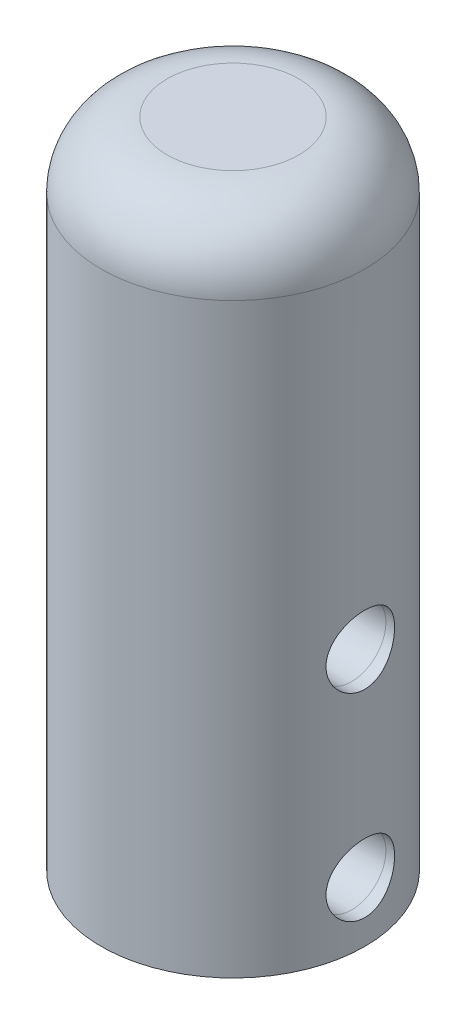
ISO-10303-21;
HEADER;
FILE_DESCRIPTION(('STEP AP214'),'2;1');
FILE_NAME('part.step','',(''),(''),'','','');
FILE_SCHEMA(('AUTOMOTIVE_DESIGN { 1 0 10303 214 1 1 1 1 }'));
ENDSEC;
DATA;
#1=APPLICATION_CONTEXT('core data for automotive mechanical design processes');
#2=APPLICATION_PROTOCOL_DEFINITION('international standard','automotive_design',2000,#1);
#3=PRODUCT_CONTEXT('',#1,'mechanical');
#4=PRODUCT('Part','Part','',(#3));
#5=PRODUCT_RELATED_PRODUCT_CATEGORY('part','',(#4));
#6=PRODUCT_DEFINITION_FORMATION('','',#4);
#7=PRODUCT_DEFINITION_CONTEXT('part definition',#1,'design');
#8=PRODUCT_DEFINITION('design','',#6,#7);
#9=PRODUCT_DEFINITION_SHAPE('','',#8);
#10=(LENGTH_UNIT() NAMED_UNIT(*) SI_UNIT(.MILLI.,.METRE.));
#11=(NAMED_UNIT(*) PLANE_ANGLE_UNIT() SI_UNIT($,.RADIAN.));
#12=(NAMED_UNIT(*) SI_UNIT($,.STERADIAN.) SOLID_ANGLE_UNIT());
#13=UNCERTAINTY_MEASURE_WITH_UNIT(LENGTH_MEASURE(1.E-05),#10,'distance_accuracy_value','');
#14=(GEOMETRIC_REPRESENTATION_CONTEXT(3) GLOBAL_UNCERTAINTY_ASSIGNED_CONTEXT((#13)) GLOBAL_UNIT_ASSIGNED_CONTEXT((#10,
#11,#12)) REPRESENTATION_CONTEXT('',''));
#15=CARTESIAN_POINT('',(0.,0.,0.));
#16=DIRECTION('',(0.,0.,1.));
#17=DIRECTION('',(1.,0.,0.));
#18=AXIS2_PLACEMENT_3D('',#15,#16,#17);
#19=CARTESIAN_POINT('',(-33.645,95.,0.));
#20=DIRECTION('',(1.,0.,0.));
#21=DIRECTION('',(0.,0.,-1.));
#22=AXIS2_PLACEMENT_3D('',#19,#20,#21);
#23=CYLINDRICAL_SURFACE('',#22,1.70000000000001);
#24=CARTESIAN_POINT('',(-27.545,95.,0.));
#25=DIRECTION('',(-1.,0.,0.));
#26=DIRECTION('',(0.,-1.,0.));
#27=AXIS2_PLACEMENT_3D('',#24,#25,#26);
#28=CIRCLE('',#27,1.70000000000001);
#29=CARTESIAN_POINT('',(-27.545,93.3,0.));
#30=VERTEX_POINT('',#29);
#31=EDGE_CURVE('E121',#30,#30,#28,.T.);
#32=ORIENTED_EDGE('',*,*,#31,.F.);
#33=EDGE_LOOP('',(#32));
#34=FACE_BOUND('',#33,.T.);
#35=CARTESIAN_POINT('',(-30.145,95.,0.));
#36=DIRECTION('',(-1.,0.,0.));
#37=DIRECTION('',(0.,-1.,0.));
#38=AXIS2_PLACEMENT_3D('',#35,#36,#37);
#39=CIRCLE('',#38,1.70000000000001);
#40=CARTESIAN_POINT('',(-30.145,93.3,0.));
#41=VERTEX_POINT('',#40);
#42=EDGE_CURVE('E210',#41,#41,#39,.F.);
#43=ORIENTED_EDGE('',*,*,#42,.F.);
#44=EDGE_LOOP('',(#43));
#45=FACE_BOUND('',#44,.T.);
#46=ADVANCED_FACE('F35',(#34,#45),#23,.F.);
#47=CARTESIAN_POINT('',(-33.645,80.,0.));
#48=DIRECTION('',(1.,0.,0.));
#49=DIRECTION('',(0.,0.,-1.));
#50=AXIS2_PLACEMENT_3D('',#47,#48,#49);
#51=CYLINDRICAL_SURFACE('',#50,1.70000000000001);
#52=CARTESIAN_POINT('',(-27.545,80.,0.));
#53=DIRECTION('',(-1.,0.,0.));
#54=DIRECTION('',(0.,-1.,0.));
#55=AXIS2_PLACEMENT_3D('',#52,#53,#54);
#56=CIRCLE('',#55,1.70000000000001);
#57=CARTESIAN_POINT('',(-27.545,78.3,0.));
#58=VERTEX_POINT('',#57);
#59=EDGE_CURVE('E126',#58,#58,#56,.T.);
#60=ORIENTED_EDGE('',*,*,#59,.F.);
#61=EDGE_LOOP('',(#60));
#62=FACE_BOUND('',#61,.T.);
#63=CARTESIAN_POINT('',(-30.145,80.,0.));
#64=DIRECTION('',(-1.,0.,0.));
#65=DIRECTION('',(0.,-1.,0.));
#66=AXIS2_PLACEMENT_3D('',#63,#64,#65);
#67=CIRCLE('',#66,1.70000000000001);
#68=CARTESIAN_POINT('',(-30.145,78.3,0.));
#69=VERTEX_POINT('',#68);
#70=EDGE_CURVE('E213',#69,#69,#67,.F.);
#71=ORIENTED_EDGE('',*,*,#70,.F.);
#72=EDGE_LOOP('',(#71));
#73=FACE_BOUND('',#72,.T.);
#74=ADVANCED_FACE('F173',(#62,#73),#51,.F.);
#75=CARTESIAN_POINT('',(-23.645,46.7157287525381,0.));
#76=DIRECTION('',(0.,1.,0.));
#77=DIRECTION('',(-1.,0.,0.));
#78=AXIS2_PLACEMENT_3D('',#75,#76,#77);
#79=CYLINDRICAL_SURFACE('',#78,10.);
#80=CARTESIAN_POINT('',(-33.645,77.15,0.));
#81=CARTESIAN_POINT('',(-33.6449981148392,77.1500028038685,0.156702222055426));
#82=CARTESIAN_POINT('',(-33.6412809618987,77.1629670882105,0.313433312054446));
#83=CARTESIAN_POINT('',(-33.6268145988117,77.2143732014747,0.622353947826402));
#84=CARTESIAN_POINT('',(-33.6160626998475,77.2528247722106,0.774541733793407));
#85=CARTESIAN_POINT('',(-33.5887089739797,77.3538338829002,1.06987393942644));
#86=CARTESIAN_POINT('',(-33.5721152825365,77.4163579100891,1.21303061082524));
#87=CARTESIAN_POINT('',(-33.5348159939189,77.5636057144373,1.48682768012773));
#88=CARTESIAN_POINT('',(-33.5141099724456,77.6483317826304,1.6174667844396));
#89=CARTESIAN_POINT('',(-33.4702011748781,77.8399174044409,1.86593929261577));
#90=CARTESIAN_POINT('',(-33.4469510780771,77.9472512808776,1.98339859784889));
#91=CARTESIAN_POINT('',(-33.400866628841,78.1799934404885,2.1989173339478));
#92=CARTESIAN_POINT('',(-33.3780323388465,78.3054044134504,2.29697387261132));
#93=CARTESIAN_POINT('',(-33.334872119392,78.5738227536689,2.47280459739312));
#94=CARTESIAN_POINT('',(-33.3146054240114,78.7171316385792,2.55013438673269));
#95=CARTESIAN_POINT('',(-33.2795770599847,79.0153892871087,2.67944864193718));
#96=CARTESIAN_POINT('',(-33.2648142138603,79.170335552527,2.73143852968244));
#97=CARTESIAN_POINT('',(-33.2429560752628,79.4832944949959,2.80727118973494));
#98=CARTESIAN_POINT('',(-33.2356747031502,79.6411279762955,2.83179848433712));
#99=CARTESIAN_POINT('',(-33.2290492312009,79.9588245656897,2.85414576761167));
#100=CARTESIAN_POINT('',(-33.2297034162181,80.1186872277472,2.85197152740062));
#101=CARTESIAN_POINT('',(-33.2387094658298,80.4304435713915,2.82151778088379));
#102=CARTESIAN_POINT('',(-33.2468125321654,80.5824280254272,2.79408198213026));
#103=CARTESIAN_POINT('',(-33.2694027480574,80.879541178131,2.71524157426037));
#104=CARTESIAN_POINT('',(-33.2838904721658,81.0246692584959,2.66383480798507));
#105=CARTESIAN_POINT('',(-33.317825415122,81.3060761777278,2.53786006677916));
#106=CARTESIAN_POINT('',(-33.3373328525366,81.4422203966578,2.46300828391955));
#107=CARTESIAN_POINT('',(-33.3790787056095,81.7003050264222,2.29246582180281));
#108=CARTESIAN_POINT('',(-33.4013177260943,81.822242279864,2.19677052373737));
#109=CARTESIAN_POINT('',(-33.4470424004349,82.053253779884,1.98300978221846));
#110=CARTESIAN_POINT('',(-33.4705435339757,82.1616744275809,1.86424019424136));
#111=CARTESIAN_POINT('',(-33.5154015954441,82.3572031477741,1.60991372563512));
#112=CARTESIAN_POINT('',(-33.5367584133177,82.4443101267055,1.47435598417412));
#113=CARTESIAN_POINT('',(-33.5750854943689,82.5950843086651,1.18919510835358));
#114=CARTESIAN_POINT('',(-33.5920307943484,82.6586189490998,1.0395183061524));
#115=CARTESIAN_POINT('',(-33.6194456606564,82.759427205276,0.731011523282429));
#116=CARTESIAN_POINT('',(-33.6299168506962,82.7967074059756,0.572183848591747));
#117=CARTESIAN_POINT('',(-33.64295204675,82.8428892069603,0.255450137061612));
#118=CARTESIAN_POINT('',(-33.645763127856,82.8526778714578,0.0976834116708369));
#119=CARTESIAN_POINT('',(-33.643879508611,82.8460680946158,-0.217242667325456));
#120=CARTESIAN_POINT('',(-33.6391857039904,82.8296727784125,-0.374402091170115));
#121=CARTESIAN_POINT('',(-33.6229805542209,82.7718828957831,-0.680388673532275));
#122=CARTESIAN_POINT('',(-33.6116076772171,82.7309957507387,-0.829319683438056));
#123=CARTESIAN_POINT('',(-33.5833471400501,82.6259834606804,-1.11818480443486));
#124=CARTESIAN_POINT('',(-33.5664588435169,82.5618556340586,-1.25811787511105));
#125=CARTESIAN_POINT('',(-33.5284781124918,82.4106215774358,-1.52836402911181));
#126=CARTESIAN_POINT('',(-33.5073028451789,82.3230494984291,-1.65840447139229));
#127=CARTESIAN_POINT('',(-33.4631882997216,82.1279876497973,-1.90225112974461));
#128=CARTESIAN_POINT('',(-33.4402486230098,82.0204933721145,-2.01605366111468));
#129=CARTESIAN_POINT('',(-33.394260008835,81.7844809588745,-2.2280240601088));
#130=CARTESIAN_POINT('',(-33.3712317967246,81.6553926188928,-2.32556282592988));
#131=CARTESIAN_POINT('',(-33.3284789462253,81.3821839017703,-2.49762376402124));
#132=CARTESIAN_POINT('',(-33.3087541917639,81.2380640530756,-2.57214674506747));
#133=CARTESIAN_POINT('',(-33.2750719491178,80.9394869051802,-2.69551617836587));
#134=CARTESIAN_POINT('',(-33.2610838384091,80.7850897473861,-2.74449935465378));
#135=CARTESIAN_POINT('',(-33.2404929669959,80.4697741402036,-2.81565501674798));
#136=CARTESIAN_POINT('',(-33.2338879824498,80.3088576696121,-2.83783557582512));
#137=CARTESIAN_POINT('',(-33.2290151857934,79.9915613908078,-2.85424530598091));
#138=CARTESIAN_POINT('',(-33.2304435556662,79.8352381911743,-2.84949301248772));
#139=CARTESIAN_POINT('',(-33.2407548946365,79.5257203473321,-2.81457143016976));
#140=CARTESIAN_POINT('',(-33.249637617306,79.3725255998736,-2.78440298155919));
#141=CARTESIAN_POINT('',(-33.2736633040637,79.0751001214109,-2.70013313019527));
#142=CARTESIAN_POINT('',(-33.288742154251,78.9307945000729,-2.64627644900901));
#143=CARTESIAN_POINT('',(-33.3234550958769,78.6531536453183,-2.51634821674443));
#144=CARTESIAN_POINT('',(-33.343089990017,78.5198203506631,-2.44027275046273));
#145=CARTESIAN_POINT('',(-33.385517454381,78.2631191958515,-2.26510160216744));
#146=CARTESIAN_POINT('',(-33.4083932811756,78.1402298043768,-2.1653248810925));
#147=CARTESIAN_POINT('',(-33.4542940368548,77.9126080678025,-1.94684135338568));
#148=CARTESIAN_POINT('',(-33.4773190017817,77.8078802956592,-1.82812979350982));
#149=CARTESIAN_POINT('',(-33.521626524702,77.6169103978416,-1.57149897377278));
#150=CARTESIAN_POINT('',(-33.5428497251346,77.5312073812228,-1.43316731635174));
#151=CARTESIAN_POINT('',(-33.5804813215053,77.3844027482626,-1.14345443992414));
#152=CARTESIAN_POINT('',(-33.5968923652489,77.3232875959628,-0.992080456782535));
#153=CARTESIAN_POINT('',(-33.6212939720349,77.234042867142,-0.701381500770176));
#154=CARTESIAN_POINT('',(-33.6301143880413,77.2026063509377,-0.563133223252123));
#155=CARTESIAN_POINT('',(-33.6419678712141,77.1605850294216,-0.283264193504875));
#156=CARTESIAN_POINT('',(-33.6450017040059,77.1499974655699,-0.141643889940742));
#157=CARTESIAN_POINT('',(-33.645,77.15,0.));
#158=B_SPLINE_CURVE_WITH_KNOTS('',3,(#80,#81,#82,#83,#84,#85,#86,#87,#88,#89,#90,#91,#92,#93,
#94,#95,#96,#97,#98,#99,#100,#101,#102,#103,#104,#105,#106,#107,#108,#109,#110,#111,#112,#113,
#114,#115,#116,#117,#118,#119,#120,#121,#122,#123,#124,#125,#126,#127,#128,#129,#130,#131,#132,
#133,#134,#135,#136,#137,#138,#139,#140,#141,#142,#143,#144,#145,#146,#147,#148,#149,#150,#151,
#152,#153,#154,#155,#156,#157),.UNSPECIFIED.,.T.,.F.,(4,2,2,2,2,2,2,2,2,2,2,2,2,2,2,2,2,2,2,2,2,
2,2,2,2,2,2,2,2,2,2,2,2,2,2,2,2,2,4),(0.,0.469586772016726,0.939353134230501,1.40846785651064,
1.87763100592849,2.35784471960703,2.83812996074797,3.32801152259435,3.81778822032061,
4.29506452214758,4.77223767002792,5.23403014041426,5.69586417575035,6.16352023552507,
6.63128003093134,7.1165757570095,7.60189637749444,8.08990632613343,8.57779383184113,
9.04974721363853,9.5216442706044,9.98408723231445,10.4465835696392,10.9190568973545,
11.3916372686433,11.8795923255132,12.3675302336642,12.8528284926698,13.3379805375326,
13.8049107773458,14.2718255818576,14.7340260451179,15.1963080025615,15.6739537080073,
16.1517195069052,16.641660830568,17.1313320644874,17.5558499715394,17.9803117065468),.UNSPECIFIED.);
#159=CARTESIAN_POINT('',(-33.645,77.15,0.));
#160=VERTEX_POINT('',#159);
#161=EDGE_CURVE('E12',#160,#160,#158,.T.);
#162=ORIENTED_EDGE('',*,*,#161,.F.);
#163=EDGE_LOOP('',(#162));
#164=FACE_BOUND('',#163,.T.);
#165=CARTESIAN_POINT('',(-33.645,92.15,0.));
#166=CARTESIAN_POINT('',(-33.6449981148392,92.1500028038684,0.156702222055426));
#167=CARTESIAN_POINT('',(-33.6412809618987,92.1629670882105,0.313433312054446));
#168=CARTESIAN_POINT('',(-33.6268145988117,92.2143732014747,0.622353947826402));
#169=CARTESIAN_POINT('',(-33.6160626998475,92.2528247722106,0.774541733793407));
#170=CARTESIAN_POINT('',(-33.5887089739797,92.3538338829002,1.06987393942644));
#171=CARTESIAN_POINT('',(-33.5721152825365,92.4163579100891,1.21303061082524));
#172=CARTESIAN_POINT('',(-33.5348159939189,92.5636057144373,1.48682768012773));
#173=CARTESIAN_POINT('',(-33.5141099724456,92.6483317826304,1.6174667844396));
#174=CARTESIAN_POINT('',(-33.4702011748781,92.8399174044409,1.86593929261578));
#175=CARTESIAN_POINT('',(-33.4469510780771,92.9472512808776,1.9833985978489));
#176=CARTESIAN_POINT('',(-33.400866628841,93.1799934404885,2.19891733394781));
#177=CARTESIAN_POINT('',(-33.3780323388465,93.3054044134504,2.29697387261132));
#178=CARTESIAN_POINT('',(-33.334872119392,93.5738227536689,2.47280459739312));
#179=CARTESIAN_POINT('',(-33.3146054240114,93.7171316385792,2.55013438673268));
#180=CARTESIAN_POINT('',(-33.2795770599847,94.0153892871087,2.67944864193718));
#181=CARTESIAN_POINT('',(-33.2648142138603,94.170335552527,2.73143852968244));
#182=CARTESIAN_POINT('',(-33.2429560752628,94.4832944949959,2.80727118973494));
#183=CARTESIAN_POINT('',(-33.2356747031502,94.6411279762955,2.83179848433712));
#184=CARTESIAN_POINT('',(-33.2290492312009,94.9588245656897,2.85414576761167));
#185=CARTESIAN_POINT('',(-33.2297034162181,95.1186872277472,2.85197152740062));
#186=CARTESIAN_POINT('',(-33.2387094658298,95.4304435713915,2.82151778088379));
#187=CARTESIAN_POINT('',(-33.2468125321654,95.5824280254272,2.79408198213026));
#188=CARTESIAN_POINT('',(-33.2694027480574,95.879541178131,2.71524157426037));
#189=CARTESIAN_POINT('',(-33.2838904721658,96.0246692584959,2.66383480798507));
#190=CARTESIAN_POINT('',(-33.317825415122,96.3060761777278,2.53786006677916));
#191=CARTESIAN_POINT('',(-33.3373328525366,96.4422203966578,2.46300828391955));
#192=CARTESIAN_POINT('',(-33.3790787056095,96.7003050264222,2.29246582180281));
#193=CARTESIAN_POINT('',(-33.4013177260943,96.822242279864,2.19677052373737));
#194=CARTESIAN_POINT('',(-33.4470424004349,97.053253779884,1.98300978221846));
#195=CARTESIAN_POINT('',(-33.4705435339757,97.1616744275809,1.86424019424136));
#196=CARTESIAN_POINT('',(-33.5154015954441,97.3572031477741,1.60991372563512));
#197=CARTESIAN_POINT('',(-33.5367584133177,97.4443101267055,1.47435598417412));
#198=CARTESIAN_POINT('',(-33.5750854943689,97.5950843086651,1.18919510835358));
#199=CARTESIAN_POINT('',(-33.5920307943484,97.6586189490998,1.0395183061524));
#200=CARTESIAN_POINT('',(-33.6194456606564,97.759427205276,0.731011523282429));
#201=CARTESIAN_POINT('',(-33.6299168506962,97.7967074059756,0.572183848591747));
#202=CARTESIAN_POINT('',(-33.64295204675,97.8428892069603,0.255450137061612));
#203=CARTESIAN_POINT('',(-33.645763127856,97.8526778714578,0.0976834116708369));
#204=CARTESIAN_POINT('',(-33.643879508611,97.8460680946158,-0.217242667325456));
#205=CARTESIAN_POINT('',(-33.6391857039904,97.8296727784125,-0.374402091170115));
#206=CARTESIAN_POINT('',(-33.6229805542209,97.771882895783,-0.680388673532275));
#207=CARTESIAN_POINT('',(-33.6116076772171,97.7309957507387,-0.829319683438056));
#208=CARTESIAN_POINT('',(-33.5833471400501,97.6259834606804,-1.11818480443486));
#209=CARTESIAN_POINT('',(-33.5664588435169,97.5618556340586,-1.25811787511105));
#210=CARTESIAN_POINT('',(-33.5284781124918,97.4106215774357,-1.52836402911181));
#211=CARTESIAN_POINT('',(-33.5073028451789,97.3230494984291,-1.6584044713923));
#212=CARTESIAN_POINT('',(-33.4631882997216,97.1279876497972,-1.90225112974461));
#213=CARTESIAN_POINT('',(-33.4402486230098,97.0204933721144,-2.01605366111469));
#214=CARTESIAN_POINT('',(-33.394260008835,96.7844809588745,-2.2280240601088));
#215=CARTESIAN_POINT('',(-33.3712317967246,96.6553926188928,-2.32556282592988));
#216=CARTESIAN_POINT('',(-33.3284789462253,96.3821839017703,-2.49762376402124));
#217=CARTESIAN_POINT('',(-33.3087541917639,96.2380640530756,-2.57214674506747));
#218=CARTESIAN_POINT('',(-33.2750719491178,95.9394869051802,-2.69551617836587));
#219=CARTESIAN_POINT('',(-33.2610838384091,95.7850897473861,-2.74449935465378));
#220=CARTESIAN_POINT('',(-33.2404929669959,95.4697741402036,-2.81565501674798));
#221=CARTESIAN_POINT('',(-33.2338879824498,95.3088576696121,-2.83783557582512));
#222=CARTESIAN_POINT('',(-33.2290151857934,94.9915613908078,-2.85424530598091));
#223=CARTESIAN_POINT('',(-33.2304435556662,94.8352381911743,-2.84949301248772));
#224=CARTESIAN_POINT('',(-33.2407548946365,94.5257203473321,-2.81457143016976));
#225=CARTESIAN_POINT('',(-33.249637617306,94.3725255998736,-2.78440298155919));
#226=CARTESIAN_POINT('',(-33.2736633040637,94.0751001214109,-2.70013313019527));
#227=CARTESIAN_POINT('',(-33.288742154251,93.9307945000728,-2.64627644900901));
#228=CARTESIAN_POINT('',(-33.3234550958769,93.6531536453183,-2.51634821674443));
#229=CARTESIAN_POINT('',(-33.343089990017,93.5198203506631,-2.44027275046273));
#230=CARTESIAN_POINT('',(-33.385517454381,93.2631191958515,-2.26510160216744));
#231=CARTESIAN_POINT('',(-33.4083932811756,93.1402298043768,-2.1653248810925));
#232=CARTESIAN_POINT('',(-33.4542940368548,92.9126080678024,-1.94684135338568));
#233=CARTESIAN_POINT('',(-33.4773190017817,92.8078802956592,-1.82812979350982));
#234=CARTESIAN_POINT('',(-33.521626524702,92.6169103978416,-1.57149897377278));
#235=CARTESIAN_POINT('',(-33.5428497251346,92.5312073812228,-1.43316731635174));
#236=CARTESIAN_POINT('',(-33.5804813215053,92.3844027482626,-1.14345443992414));
#237=CARTESIAN_POINT('',(-33.5968923652489,92.3232875959628,-0.992080456782535));
#238=CARTESIAN_POINT('',(-33.6212939720349,92.234042867142,-0.701381500770176));
#239=CARTESIAN_POINT('',(-33.6301143880413,92.2026063509377,-0.563133223252123));
#240=CARTESIAN_POINT('',(-33.6419678712141,92.1605850294216,-0.283264193504875));
#241=CARTESIAN_POINT('',(-33.6450017040059,92.1499974655699,-0.141643889940742));
#242=CARTESIAN_POINT('',(-33.645,92.15,0.));
#243=B_SPLINE_CURVE_WITH_KNOTS('',3,(#165,#166,#167,#168,#169,#170,#171,#172,#173,#174,#175,
#176,#177,#178,#179,#180,#181,#182,#183,#184,#185,#186,#187,#188,#189,#190,#191,#192,#193,#194,
#195,#196,#197,#198,#199,#200,#201,#202,#203,#204,#205,#206,#207,#208,#209,#210,#211,#212,#213,
#214,#215,#216,#217,#218,#219,#220,#221,#222,#223,#224,#225,#226,#227,#228,#229,#230,#231,#232,
#233,#234,#235,#236,#237,#238,#239,#240,#241,#242),.UNSPECIFIED.,.T.,.F.,(4,2,2,2,2,2,2,2,2,2,2,
2,2,2,2,2,2,2,2,2,2,2,2,2,2,2,2,2,2,2,2,2,2,2,2,2,2,2,4),(0.,0.469586772016726,
0.939353134230501,1.40846785651064,1.87763100592849,2.35784471960705,2.83812996074797,
3.32801152259433,3.81778822032061,4.29506452214758,4.77223767002792,5.23403014041426,
5.69586417575035,6.16352023552507,6.63128003093134,7.1165757570095,7.60189637749444,
8.08990632613343,8.57779383184113,9.04974721363853,9.5216442706044,9.98408723231445,
10.4465835696392,10.9190568973545,11.3916372686433,11.8795923255132,12.3675302336642,
12.8528284926698,13.3379805375326,13.8049107773458,14.2718255818576,14.7340260451179,
15.1963080025615,15.6739537080073,16.1517195069052,16.641660830568,17.1313320644874,
17.5558499715394,17.9803117065468),.UNSPECIFIED.);
#244=CARTESIAN_POINT('',(-33.645,92.15,0.));
#245=VERTEX_POINT('',#244);
#246=EDGE_CURVE('E47',#245,#245,#243,.T.);
#247=ORIENTED_EDGE('',*,*,#246,.F.);
#248=EDGE_LOOP('',(#247));
#249=FACE_BOUND('',#248,.T.);
#250=CARTESIAN_POINT('',(-23.645,120.,0.));
#251=DIRECTION('',(0.,1.,0.));
#252=DIRECTION('',(-1.,0.,0.));
#253=AXIS2_PLACEMENT_3D('',#250,#251,#252);
#254=CIRCLE('',#253,10.);
#255=CARTESIAN_POINT('',(-33.645,120.,0.));
#256=VERTEX_POINT('',#255);
#257=EDGE_CURVE('E116',#256,#256,#254,.F.);
#258=ORIENTED_EDGE('',*,*,#257,.T.);
#259=EDGE_LOOP('',(#258));
#260=FACE_BOUND('',#259,.T.);
#261=CARTESIAN_POINT('',(-23.645,75.5,0.));
#262=DIRECTION('',(0.,1.,0.));
#263=DIRECTION('',(-1.,0.,0.));
#264=AXIS2_PLACEMENT_3D('',#261,#262,#263);
#265=CIRCLE('',#264,10.);
#266=CARTESIAN_POINT('',(-33.645,75.5,0.));
#267=VERTEX_POINT('',#266);
#268=EDGE_CURVE('E117',#267,#267,#265,.F.);
#269=ORIENTED_EDGE('',*,*,#268,.F.);
#270=EDGE_LOOP('',(#269));
#271=FACE_BOUND('',#270,.T.);
#272=CARTESIAN_POINT('',(-13.645,97.6,0.));
#273=CARTESIAN_POINT('',(-13.6450022817509,97.5999963317231,-0.143461557343221));
#274=CARTESIAN_POINT('',(-13.64811771801,97.5880863541353,-0.28696307789456));
#275=CARTESIAN_POINT('',(-13.6602435327051,97.5408401503296,-0.569840826995814));
#276=CARTESIAN_POINT('',(-13.6692569527748,97.5054918366635,-0.709214888198695));
#277=CARTESIAN_POINT('',(-13.6921825647781,97.4125893881235,-0.979712906927253));
#278=CARTESIAN_POINT('',(-13.7060886140724,97.3550630888212,-1.11084696748465));
#279=CARTESIAN_POINT('',(-13.7373252444654,97.219538693623,-1.36160495984503));
#280=CARTESIAN_POINT('',(-13.7546560084748,97.1415395042172,-1.48122827636296));
#281=CARTESIAN_POINT('',(-13.7912956674692,96.9654601813591,-1.70821705852408));
#282=CARTESIAN_POINT('',(-13.8106370492413,96.8670115214125,-1.81529141719993));
#283=CARTESIAN_POINT('',(-13.8489065334675,96.6536161416951,-2.01161083640164));
#284=CARTESIAN_POINT('',(-13.8678345852014,96.5386674101452,-2.1008537196379));
#285=CARTESIAN_POINT('',(-13.9034646429184,96.293237022512,-2.26037576632186));
#286=CARTESIAN_POINT('',(-13.9201255558058,96.1625336354661,-2.33032380649516));
#287=CARTESIAN_POINT('',(-13.9488588383011,95.890719184103,-2.44713920878393));
#288=CARTESIAN_POINT('',(-13.9609320077108,95.7496099390124,-2.49401059437805));
#289=CARTESIAN_POINT('',(-13.9787880378106,95.4642041010566,-2.56233845779895));
#290=CARTESIAN_POINT('',(-13.9847008740128,95.3200417690649,-2.58432096580449));
#291=CARTESIAN_POINT('',(-13.989955388155,95.029963539972,-2.60388645934352));
#292=CARTESIAN_POINT('',(-13.9892982286793,94.8840479576788,-2.601473761695));
#293=CARTESIAN_POINT('',(-13.9816035404561,94.5986805743318,-2.57273579210169));
#294=CARTESIAN_POINT('',(-13.9747347943515,94.459159804177,-2.54704305477524));
#295=CARTESIAN_POINT('',(-13.9556606012278,94.1864804209399,-2.47348576208218));
#296=CARTESIAN_POINT('',(-13.9434547465045,94.0533222947649,-2.42561951285409));
#297=CARTESIAN_POINT('',(-13.9149305771421,93.7954800570663,-2.30854895360789));
#298=CARTESIAN_POINT('',(-13.8985692617086,93.6709030257153,-2.23911972332897));
#299=CARTESIAN_POINT('',(-13.8636012639094,93.4349435602546,-2.0810511088295));
#300=CARTESIAN_POINT('',(-13.8449941596756,93.3235636130092,-1.99240811283475));
#301=CARTESIAN_POINT('',(-13.806925268941,93.1135415603956,-1.79517679870832));
#302=CARTESIAN_POINT('',(-13.7874548507337,93.0154001785762,-1.68605623430295));
#303=CARTESIAN_POINT('',(-13.7503705792726,92.8387102616642,-1.45266958333244));
#304=CARTESIAN_POINT('',(-13.732756792229,92.7601624251693,-1.32840295697729));
#305=CARTESIAN_POINT('',(-13.7012707105428,92.6246838384352,-1.06750110603797));
#306=CARTESIAN_POINT('',(-13.6874135071659,92.5678399164137,-0.930818854189984));
#307=CARTESIAN_POINT('',(-13.6651112420614,92.4780790019277,-0.649396523784745));
#308=CARTESIAN_POINT('',(-13.6566650579587,92.4451570472841,-0.504658123039884));
#309=CARTESIAN_POINT('',(-13.6463047430971,92.4049520362114,-0.215508531257719));
#310=CARTESIAN_POINT('',(-13.6442171018159,92.3969877607876,-0.0711981359237205));
#311=CARTESIAN_POINT('',(-13.6463121394466,92.4050481541739,0.216695116771972));
#312=CARTESIAN_POINT('',(-13.6504942045516,92.4210704746868,0.360278043972309));
#313=CARTESIAN_POINT('',(-13.6645470315387,92.4760893151325,0.640235323682913));
#314=CARTESIAN_POINT('',(-13.6743244929116,92.5147092622615,0.776688793417186));
#315=CARTESIAN_POINT('',(-13.698462085878,92.6133927029992,1.04116971053157));
#316=CARTESIAN_POINT('',(-13.7128227010103,92.6734584592955,1.16919626712278));
#317=CARTESIAN_POINT('',(-13.7449439446486,92.814615019021,1.41586198403351));
#318=CARTESIAN_POINT('',(-13.7627635724435,92.8960808785712,1.53427864310433));
#319=CARTESIAN_POINT('',(-13.7997413850607,93.0772504433254,1.75600088294379));
#320=CARTESIAN_POINT('',(-13.8188998202943,93.1769575660596,1.85930362555792));
#321=CARTESIAN_POINT('',(-13.8570288055331,93.3949522056671,2.05071066291276));
#322=CARTESIAN_POINT('',(-13.875980674093,93.5136648160493,2.13833539496245));
#323=CARTESIAN_POINT('',(-13.9109848503917,93.7645060665079,2.29242596803189));
#324=CARTESIAN_POINT('',(-13.9270372831525,93.8966341277341,2.35889272146548));
#325=CARTESIAN_POINT('',(-13.9542431102903,94.1698722097096,2.46828068475577));
#326=CARTESIAN_POINT('',(-13.9654251900414,94.3109238760307,2.51134014205601));
#327=CARTESIAN_POINT('',(-13.9816399064259,94.5986034296297,2.57303487443038));
#328=CARTESIAN_POINT('',(-13.9866740208217,94.7452299681567,2.59167601891697));
#329=CARTESIAN_POINT('',(-13.9899037369818,95.0349996674078,2.60367976027314));
#330=CARTESIAN_POINT('',(-13.9883073770088,95.1781091440358,2.59781133859025));
#331=CARTESIAN_POINT('',(-13.9789406174438,95.4612225306755,2.56273659838173));
#332=CARTESIAN_POINT('',(-13.97117036213,95.6012265131811,2.53353082522869));
#333=CARTESIAN_POINT('',(-13.950451992993,95.8732405538469,2.4530459325271));
#334=CARTESIAN_POINT('',(-13.9375403610453,96.0052995449597,2.40192214562752));
#335=CARTESIAN_POINT('',(-13.9079915120375,96.2590636608092,2.27917380239356));
#336=CARTESIAN_POINT('',(-13.8913537375544,96.3807672326347,2.20754617828313));
#337=CARTESIAN_POINT('',(-13.8556437151062,96.6140549345384,2.04346026045225));
#338=CARTESIAN_POINT('',(-13.8365162328283,96.7252590286834,1.95047359785646));
#339=CARTESIAN_POINT('',(-13.798298905214,96.9307349495758,1.7473241295585));
#340=CARTESIAN_POINT('',(-13.7792090700424,97.0250026952021,1.63715719587221));
#341=CARTESIAN_POINT('',(-13.7427610426242,97.1957802922383,1.40011119788575));
#342=CARTESIAN_POINT('',(-13.725445197005,97.2718966071839,1.27294157409668));
#343=CARTESIAN_POINT('',(-13.6949524040021,97.4015495987193,1.00716820299807));
#344=CARTESIAN_POINT('',(-13.6817726748756,97.4551014593616,0.86857222003418));
#345=CARTESIAN_POINT('',(-13.6628414994333,97.5307254735429,0.608648981246495));
#346=CARTESIAN_POINT('',(-13.6561985413685,97.5566448140635,0.488491661745836));
#347=CARTESIAN_POINT('',(-13.6472770085162,97.5912828849897,0.245565833172077));
#348=CARTESIAN_POINT('',(-13.6449980469093,97.6000031399035,0.122797556506499));
#349=CARTESIAN_POINT('',(-13.645,97.6,0.));
#350=B_SPLINE_CURVE_WITH_KNOTS('',3,(#272,#273,#274,#275,#276,#277,#278,#279,#280,#281,#282,
#283,#284,#285,#286,#287,#288,#289,#290,#291,#292,#293,#294,#295,#296,#297,#298,#299,#300,#301,
#302,#303,#304,#305,#306,#307,#308,#309,#310,#311,#312,#313,#314,#315,#316,#317,#318,#319,#320,
#321,#322,#323,#324,#325,#326,#327,#328,#329,#330,#331,#332,#333,#334,#335,#336,#337,#338,#339,
#340,#341,#342,#343,#344,#345,#346,#347,#348,#349),.UNSPECIFIED.,.T.,.F.,(4,2,2,2,2,2,2,2,2,2,2,
2,2,2,2,2,2,2,2,2,2,2,2,2,2,2,2,2,2,2,2,2,2,2,2,2,2,2,4),(0.,0.429934474066831,
0.860090843440722,1.28970907235791,1.71935025296284,2.15753633720073,2.59577589293958,
3.04112475628265,3.48639594429567,3.92206951869646,4.35766600046569,4.78177068780135,
5.20590777835264,5.63462664248517,6.06342616653084,6.505492584549,6.94757476196668,
7.39140744168554,7.8351480300438,8.26666626217952,8.69814225126951,9.12262491558317,
9.54715237912454,9.97968392093793,10.4122965813725,10.856462519252,11.3006093003833,
11.7421035592481,12.1834916769672,12.6111370956013,13.0387725208446,13.4634261367134,
13.888143322328,14.3247845723566,14.7615308983275,15.2070257711669,15.652220381372,
16.0202603229323,16.38826764037),.UNSPECIFIED.);
#351=CARTESIAN_POINT('',(-13.645,97.6,0.));
#352=VERTEX_POINT('',#351);
#353=EDGE_CURVE('E120',#352,#352,#350,.T.);
#354=ORIENTED_EDGE('',*,*,#353,.T.);
#355=EDGE_LOOP('',(#354));
#356=FACE_BOUND('',#355,.T.);
#357=CARTESIAN_POINT('',(-13.645,82.6,0.));
#358=CARTESIAN_POINT('',(-13.6450022817509,82.5999963317231,-0.143461557343221));
#359=CARTESIAN_POINT('',(-13.64811771801,82.5880863541353,-0.28696307789456));
#360=CARTESIAN_POINT('',(-13.6602435327051,82.5408401503296,-0.569840826995814));
#361=CARTESIAN_POINT('',(-13.6692569527748,82.5054918366635,-0.709214888198695));
#362=CARTESIAN_POINT('',(-13.6921825647781,82.4125893881236,-0.979712906927253));
#363=CARTESIAN_POINT('',(-13.7060886140724,82.3550630888212,-1.11084696748465));
#364=CARTESIAN_POINT('',(-13.7373252444654,82.219538693623,-1.36160495984503));
#365=CARTESIAN_POINT('',(-13.7546560084748,82.1415395042172,-1.48122827636296));
#366=CARTESIAN_POINT('',(-13.7912956674692,81.9654601813591,-1.70821705852408));
#367=CARTESIAN_POINT('',(-13.8106370492413,81.8670115214125,-1.81529141719993));
#368=CARTESIAN_POINT('',(-13.8489065334675,81.6536161416951,-2.01161083640164));
#369=CARTESIAN_POINT('',(-13.8678345852014,81.5386674101452,-2.1008537196379));
#370=CARTESIAN_POINT('',(-13.9034646429184,81.2932370225121,-2.26037576632186));
#371=CARTESIAN_POINT('',(-13.9201255558058,81.1625336354662,-2.33032380649516));
#372=CARTESIAN_POINT('',(-13.9488588383011,80.890719184103,-2.44713920878393));
#373=CARTESIAN_POINT('',(-13.9609320077108,80.7496099390124,-2.49401059437805));
#374=CARTESIAN_POINT('',(-13.9787880378106,80.4642041010566,-2.56233845779895));
#375=CARTESIAN_POINT('',(-13.9847008740128,80.3200417690649,-2.58432096580449));
#376=CARTESIAN_POINT('',(-13.989955388155,80.029963539972,-2.60388645934352));
#377=CARTESIAN_POINT('',(-13.9892982286793,79.8840479576789,-2.601473761695));
#378=CARTESIAN_POINT('',(-13.9816035404561,79.5986805743318,-2.57273579210169));
#379=CARTESIAN_POINT('',(-13.9747347943515,79.4591598041771,-2.54704305477524));
#380=CARTESIAN_POINT('',(-13.9556606012278,79.1864804209399,-2.47348576208218));
#381=CARTESIAN_POINT('',(-13.9434547465045,79.0533222947649,-2.42561951285409));
#382=CARTESIAN_POINT('',(-13.9149305771421,78.7954800570663,-2.30854895360789));
#383=CARTESIAN_POINT('',(-13.8985692617086,78.6709030257153,-2.23911972332897));
#384=CARTESIAN_POINT('',(-13.8636012639094,78.4349435602546,-2.0810511088295));
#385=CARTESIAN_POINT('',(-13.8449941596756,78.3235636130092,-1.99240811283475));
#386=CARTESIAN_POINT('',(-13.806925268941,78.1135415603956,-1.79517679870832));
#387=CARTESIAN_POINT('',(-13.7874548507337,78.0154001785762,-1.68605623430295));
#388=CARTESIAN_POINT('',(-13.7503705792726,77.8387102616642,-1.45266958333244));
#389=CARTESIAN_POINT('',(-13.732756792229,77.7601624251693,-1.32840295697729));
#390=CARTESIAN_POINT('',(-13.7012707105428,77.6246838384353,-1.06750110603797));
#391=CARTESIAN_POINT('',(-13.6874135071659,77.5678399164137,-0.930818854189984));
#392=CARTESIAN_POINT('',(-13.6651112420614,77.4780790019277,-0.649396523784745));
#393=CARTESIAN_POINT('',(-13.6566650579587,77.4451570472841,-0.504658123039884));
#394=CARTESIAN_POINT('',(-13.6463047430971,77.4049520362114,-0.215508531257719));
#395=CARTESIAN_POINT('',(-13.6442171018159,77.3969877607876,-0.0711981359237205));
#396=CARTESIAN_POINT('',(-13.6463121394466,77.405048154174,0.216695116771972));
#397=CARTESIAN_POINT('',(-13.6504942045516,77.4210704746868,0.360278043972309));
#398=CARTESIAN_POINT('',(-13.6645470315387,77.4760893151326,0.640235323682913));
#399=CARTESIAN_POINT('',(-13.6743244929116,77.5147092622616,0.776688793417186));
#400=CARTESIAN_POINT('',(-13.698462085878,77.6133927029992,1.04116971053157));
#401=CARTESIAN_POINT('',(-13.7128227010103,77.6734584592956,1.16919626712278));
#402=CARTESIAN_POINT('',(-13.7449439446486,77.814615019021,1.41586198403351));
#403=CARTESIAN_POINT('',(-13.7627635724435,77.8960808785712,1.53427864310433));
#404=CARTESIAN_POINT('',(-13.7997413850607,78.0772504433255,1.75600088294379));
#405=CARTESIAN_POINT('',(-13.8188998202943,78.1769575660596,1.85930362555792));
#406=CARTESIAN_POINT('',(-13.8570288055331,78.3949522056671,2.05071066291276));
#407=CARTESIAN_POINT('',(-13.875980674093,78.5136648160493,2.13833539496246));
#408=CARTESIAN_POINT('',(-13.9109848503917,78.7645060665079,2.29242596803189));
#409=CARTESIAN_POINT('',(-13.9270372831525,78.8966341277341,2.35889272146548));
#410=CARTESIAN_POINT('',(-13.9542431102903,79.1698722097096,2.46828068475577));
#411=CARTESIAN_POINT('',(-13.9654251900414,79.3109238760307,2.51134014205601));
#412=CARTESIAN_POINT('',(-13.9816399064259,79.5986034296297,2.57303487443038));
#413=CARTESIAN_POINT('',(-13.9866740208217,79.7452299681567,2.59167601891697));
#414=CARTESIAN_POINT('',(-13.9899037369818,80.0349996674078,2.60367976027314));
#415=CARTESIAN_POINT('',(-13.9883073770088,80.1781091440358,2.59781133859025));
#416=CARTESIAN_POINT('',(-13.9789406174438,80.4612225306755,2.56273659838173));
#417=CARTESIAN_POINT('',(-13.97117036213,80.6012265131812,2.53353082522869));
#418=CARTESIAN_POINT('',(-13.950451992993,80.8732405538469,2.4530459325271));
#419=CARTESIAN_POINT('',(-13.9375403610453,81.0052995449597,2.40192214562752));
#420=CARTESIAN_POINT('',(-13.9079915120375,81.2590636608092,2.27917380239356));
#421=CARTESIAN_POINT('',(-13.8913537375544,81.3807672326347,2.20754617828313));
#422=CARTESIAN_POINT('',(-13.8556437151062,81.6140549345385,2.04346026045225));
#423=CARTESIAN_POINT('',(-13.8365162328283,81.7252590286834,1.95047359785646));
#424=CARTESIAN_POINT('',(-13.798298905214,81.9307349495758,1.7473241295585));
#425=CARTESIAN_POINT('',(-13.7792090700424,82.0250026952021,1.63715719587221));
#426=CARTESIAN_POINT('',(-13.7427610426242,82.1957802922383,1.40011119788575));
#427=CARTESIAN_POINT('',(-13.725445197005,82.2718966071839,1.27294157409668));
#428=CARTESIAN_POINT('',(-13.6949524040021,82.4015495987193,1.00716820299807));
#429=CARTESIAN_POINT('',(-13.6817726748756,82.4551014593616,0.86857222003418));
#430=CARTESIAN_POINT('',(-13.6628414994333,82.5307254735429,0.608648981246494));
#431=CARTESIAN_POINT('',(-13.6561985413685,82.5566448140635,0.488491661745834));
#432=CARTESIAN_POINT('',(-13.6472770085162,82.5912828849897,0.245565833172074));
#433=CARTESIAN_POINT('',(-13.6449980469093,82.6000031399035,0.122797556506498));
#434=CARTESIAN_POINT('',(-13.645,82.6,0.));
#435=B_SPLINE_CURVE_WITH_KNOTS('',3,(#357,#358,#359,#360,#361,#362,#363,#364,#365,#366,#367,
#368,#369,#370,#371,#372,#373,#374,#375,#376,#377,#378,#379,#380,#381,#382,#383,#384,#385,#386,
#387,#388,#389,#390,#391,#392,#393,#394,#395,#396,#397,#398,#399,#400,#401,#402,#403,#404,#405,
#406,#407,#408,#409,#410,#411,#412,#413,#414,#415,#416,#417,#418,#419,#420,#421,#422,#423,#424,
#425,#426,#427,#428,#429,#430,#431,#432,#433,#434),.UNSPECIFIED.,.T.,.F.,(4,2,2,2,2,2,2,2,2,2,2,
2,2,2,2,2,2,2,2,2,2,2,2,2,2,2,2,2,2,2,2,2,2,2,2,2,2,2,4),(0.,0.429934474066831,
0.860090843440722,1.28970907235791,1.71935025296284,2.15753633720073,2.59577589293958,
3.04112475628265,3.48639594429567,3.92206951869646,4.35766600046569,4.78177068780135,
5.20590777835264,5.63462664248517,6.06342616653084,6.505492584549,6.94757476196668,
7.39140744168554,7.8351480300438,8.26666626217952,8.69814225126951,9.12262491558317,
9.54715237912454,9.97968392093793,10.4122965813725,10.856462519252,11.3006093003833,
11.7421035592481,12.1834916769672,12.6111370956013,13.0387725208446,13.4634261367134,
13.888143322328,14.3247845723567,14.7615308983275,15.2070257711669,15.652220381372,
16.0202603229323,16.38826764037),.UNSPECIFIED.);
#436=CARTESIAN_POINT('',(-13.645,82.6,0.));
#437=VERTEX_POINT('',#436);
#438=EDGE_CURVE('E141',#437,#437,#435,.T.);
#439=ORIENTED_EDGE('',*,*,#438,.T.);
#440=EDGE_LOOP('',(#439));
#441=FACE_BOUND('',#440,.T.);
#442=ADVANCED_FACE('F147',(#164,#249,#260,#271,#356,#441),#79,.T.);
#443=CARTESIAN_POINT('',(-19.745,95.,0.));
#444=DIRECTION('',(1.,0.,0.));
#445=DIRECTION('',(0.,1.,0.));
#446=AXIS2_PLACEMENT_3D('',#443,#444,#445);
#447=CIRCLE('',#446,1.70000000000001);
#448=CARTESIAN_POINT('',(-19.745,96.7,0.));
#449=VERTEX_POINT('',#448);
#450=EDGE_CURVE('E124',#449,#449,#447,.T.);
#451=ORIENTED_EDGE('',*,*,#450,.F.);
#452=EDGE_LOOP('',(#451));
#453=FACE_BOUND('',#452,.T.);
#454=CARTESIAN_POINT('',(-18.545,95.,0.));
#455=DIRECTION('',(1.,0.,0.));
#456=DIRECTION('',(0.,1.,0.));
#457=AXIS2_PLACEMENT_3D('',#454,#455,#456);
#458=CIRCLE('',#457,1.70000000000001);
#459=CARTESIAN_POINT('',(-18.545,96.7,0.));
#460=VERTEX_POINT('',#459);
#461=EDGE_CURVE('E125',#460,#460,#458,.F.);
#462=ORIENTED_EDGE('',*,*,#461,.F.);
#463=EDGE_LOOP('',(#462));
#464=FACE_BOUND('',#463,.T.);
#465=ADVANCED_FACE('F171',(#453,#464),#23,.F.);
#466=CARTESIAN_POINT('',(-19.745,80.,0.));
#467=DIRECTION('',(1.,0.,0.));
#468=DIRECTION('',(0.,1.,0.));
#469=AXIS2_PLACEMENT_3D('',#466,#467,#468);
#470=CIRCLE('',#469,1.70000000000001);
#471=CARTESIAN_POINT('',(-19.745,81.7,0.));
#472=VERTEX_POINT('',#471);
#473=EDGE_CURVE('E88',#472,#472,#470,.T.);
#474=ORIENTED_EDGE('',*,*,#473,.F.);
#475=EDGE_LOOP('',(#474));
#476=FACE_BOUND('',#475,.T.);
#477=CARTESIAN_POINT('',(-18.545,80.,0.));
#478=DIRECTION('',(1.,0.,0.));
#479=DIRECTION('',(0.,1.,0.));
#480=AXIS2_PLACEMENT_3D('',#477,#478,#479);
#481=CIRCLE('',#480,1.70000000000001);
#482=CARTESIAN_POINT('',(-18.545,81.7,0.));
#483=VERTEX_POINT('',#482);
#484=EDGE_CURVE('E129',#483,#483,#481,.F.);
#485=ORIENTED_EDGE('',*,*,#484,.F.);
#486=EDGE_LOOP('',(#485));
#487=FACE_BOUND('',#486,.T.);
#488=ADVANCED_FACE('F168',(#476,#487),#51,.F.);
#489=CARTESIAN_POINT('',(-24.145,46.7157287525381,4.4));
#490=DIRECTION('',(0.,0.,1.));
#491=DIRECTION('',(0.,-1.,0.));
#492=AXIS2_PLACEMENT_3D('',#489,#490,#491);
#493=PLANE('',#492);
#494=DIRECTION('',(0.,1.,0.));
#495=VECTOR('',#494,1.);
#496=CARTESIAN_POINT('',(-19.745,46.7157287525381,4.4));
#497=LINE('',#496,#495);
#498=CARTESIAN_POINT('',(-19.745,75.5,4.4));
#499=VERTEX_POINT('',#498);
#500=CARTESIAN_POINT('',(-19.745,100.,4.4));
#501=VERTEX_POINT('',#500);
#502=EDGE_CURVE('E100',#499,#501,#497,.T.);
#503=ORIENTED_EDGE('',*,*,#502,.F.);
#504=DIRECTION('',(-1.,0.,0.));
#505=VECTOR('',#504,1.);
#506=CARTESIAN_POINT('',(-24.145,75.5,4.4));
#507=LINE('',#506,#505);
#508=CARTESIAN_POINT('',(-27.545,75.5,4.4));
#509=VERTEX_POINT('',#508);
#510=EDGE_CURVE('E54',#499,#509,#507,.T.);
#511=ORIENTED_EDGE('',*,*,#510,.T.);
#512=DIRECTION('',(0.,1.,0.));
#513=VECTOR('',#512,1.);
#514=CARTESIAN_POINT('',(-27.545,46.7157287525381,4.4));
#515=LINE('',#514,#513);
#516=CARTESIAN_POINT('',(-27.545,100.,4.4));
#517=VERTEX_POINT('',#516);
#518=EDGE_CURVE('E91',#509,#517,#515,.T.);
#519=ORIENTED_EDGE('',*,*,#518,.T.);
#520=DIRECTION('',(1.,0.,0.));
#521=VECTOR('',#520,1.);
#522=CARTESIAN_POINT('',(-24.145,100.,4.4));
#523=LINE('',#522,#521);
#524=EDGE_CURVE('E77',#517,#501,#523,.T.);
#525=ORIENTED_EDGE('',*,*,#524,.T.);
#526=EDGE_LOOP('',(#503,#511,#519,#525));
#527=FACE_BOUND('',#526,.T.);
#528=ADVANCED_FACE('F92',(#527),#493,.F.);
#529=CARTESIAN_POINT('',(-19.745,46.7157287525381,4.4));
#530=DIRECTION('',(1.,0.,0.));
#531=DIRECTION('',(0.,1.,0.));
#532=AXIS2_PLACEMENT_3D('',#529,#530,#531);
#533=PLANE('',#532);
#534=ORIENTED_EDGE('',*,*,#473,.T.);
#535=EDGE_LOOP('',(#534));
#536=FACE_BOUND('',#535,.T.);
#537=ORIENTED_EDGE('',*,*,#450,.T.);
#538=EDGE_LOOP('',(#537));
#539=FACE_BOUND('',#538,.T.);
#540=DIRECTION('',(0.,1.,0.));
#541=VECTOR('',#540,1.);
#542=CARTESIAN_POINT('',(-19.745,46.7157287525381,-4.40000000000001));
#543=LINE('',#542,#541);
#544=CARTESIAN_POINT('',(-19.745,75.5,-4.4));
#545=VERTEX_POINT('',#544);
#546=CARTESIAN_POINT('',(-19.745,100.,-4.40000000000001));
#547=VERTEX_POINT('',#546);
#548=EDGE_CURVE('E103',#545,#547,#543,.T.);
#549=ORIENTED_EDGE('',*,*,#548,.F.);
#550=DIRECTION('',(0.,0.,1.));
#551=VECTOR('',#550,1.);
#552=CARTESIAN_POINT('',(-19.745,75.5,4.4));
#553=LINE('',#552,#551);
#554=EDGE_CURVE('E58',#545,#499,#553,.T.);
#555=ORIENTED_EDGE('',*,*,#554,.T.);
#556=ORIENTED_EDGE('',*,*,#502,.T.);
#557=DIRECTION('',(0.,0.,-1.));
#558=VECTOR('',#557,1.);
#559=CARTESIAN_POINT('',(-19.745,100.,4.4));
#560=LINE('',#559,#558);
#561=EDGE_CURVE('E84',#501,#547,#560,.T.);
#562=ORIENTED_EDGE('',*,*,#561,.T.);
#563=EDGE_LOOP('',(#549,#555,#556,#562));
#564=FACE_BOUND('',#563,.T.);
#565=ADVANCED_FACE('F193',(#536,#539,#564),#533,.F.);
#566=CARTESIAN_POINT('',(-24.145,46.7157287525381,-4.40000000000001));
#567=DIRECTION('',(0.,0.,-1.));
#568=DIRECTION('',(-1.,0.,0.));
#569=AXIS2_PLACEMENT_3D('',#566,#567,#568);
#570=PLANE('',#569);
#571=DIRECTION('',(0.,1.,0.));
#572=VECTOR('',#571,1.);
#573=CARTESIAN_POINT('',(-27.545,46.7157287525381,-4.4));
#574=LINE('',#573,#572);
#575=CARTESIAN_POINT('',(-27.545,75.5,-4.4));
#576=VERTEX_POINT('',#575);
#577=CARTESIAN_POINT('',(-27.545,100.,-4.4));
#578=VERTEX_POINT('',#577);
#579=EDGE_CURVE('E95',#576,#578,#574,.T.);
#580=ORIENTED_EDGE('',*,*,#579,.F.);
#581=DIRECTION('',(1.,0.,0.));
#582=VECTOR('',#581,1.);
#583=CARTESIAN_POINT('',(-24.145,75.5,-4.40000000000001));
#584=LINE('',#583,#582);
#585=EDGE_CURVE('E266',#576,#545,#584,.T.);
#586=ORIENTED_EDGE('',*,*,#585,.T.);
#587=ORIENTED_EDGE('',*,*,#548,.T.);
#588=DIRECTION('',(-1.,0.,0.));
#589=VECTOR('',#588,1.);
#590=CARTESIAN_POINT('',(-24.145,100.,-4.40000000000001));
#591=LINE('',#590,#589);
#592=EDGE_CURVE('E101',#547,#578,#591,.T.);
#593=ORIENTED_EDGE('',*,*,#592,.T.);
#594=EDGE_LOOP('',(#580,#586,#587,#593));
#595=FACE_BOUND('',#594,.T.);
#596=ADVANCED_FACE('F189',(#595),#570,.F.);
#597=CARTESIAN_POINT('',(-27.545,46.7157287525381,-4.4));
#598=DIRECTION('',(-1.,0.,0.));
#599=DIRECTION('',(0.,-1.,0.));
#600=AXIS2_PLACEMENT_3D('',#597,#598,#599);
#601=PLANE('',#600);
#602=ORIENTED_EDGE('',*,*,#59,.T.);
#603=EDGE_LOOP('',(#602));
#604=FACE_BOUND('',#603,.T.);
#605=ORIENTED_EDGE('',*,*,#31,.T.);
#606=EDGE_LOOP('',(#605));
#607=FACE_BOUND('',#606,.T.);
#608=ORIENTED_EDGE('',*,*,#518,.F.);
#609=DIRECTION('',(0.,0.,-1.));
#610=VECTOR('',#609,1.);
#611=CARTESIAN_POINT('',(-27.545,75.5,-4.4));
#612=LINE('',#611,#610);
#613=EDGE_CURVE('E112',#509,#576,#612,.T.);
#614=ORIENTED_EDGE('',*,*,#613,.T.);
#615=ORIENTED_EDGE('',*,*,#579,.T.);
#616=DIRECTION('',(0.,0.,1.));
#617=VECTOR('',#616,1.);
#618=CARTESIAN_POINT('',(-27.545,100.,-4.4));
#619=LINE('',#618,#617);
#620=EDGE_CURVE('E81',#578,#517,#619,.T.);
#621=ORIENTED_EDGE('',*,*,#620,.T.);
#622=EDGE_LOOP('',(#608,#614,#615,#621));
#623=FACE_BOUND('',#622,.T.);
#624=ADVANCED_FACE('F97',(#604,#607,#623),#601,.F.);
#625=CARTESIAN_POINT('',(-24.145,75.5,0.));
#626=DIRECTION('',(0.,1.,0.));
#627=DIRECTION('',(-1.,0.,0.));
#628=AXIS2_PLACEMENT_3D('',#625,#626,#627);
#629=PLANE('',#628);
#630=ORIENTED_EDGE('',*,*,#268,.T.);
#631=EDGE_LOOP('',(#630));
#632=FACE_BOUND('',#631,.T.);
#633=ORIENTED_EDGE('',*,*,#510,.F.);
#634=ORIENTED_EDGE('',*,*,#554,.F.);
#635=ORIENTED_EDGE('',*,*,#585,.F.);
#636=ORIENTED_EDGE('',*,*,#613,.F.);
#637=EDGE_LOOP('',(#633,#634,#635,#636));
#638=FACE_BOUND('',#637,.T.);
#639=ADVANCED_FACE('F183',(#632,#638),#629,.F.);
#640=CARTESIAN_POINT('',(-23.645,100.,0.));
#641=DIRECTION('',(0.,1.,0.));
#642=DIRECTION('',(-1.,0.,0.));
#643=AXIS2_PLACEMENT_3D('',#640,#641,#642);
#644=PLANE('',#643);
#645=ORIENTED_EDGE('',*,*,#620,.F.);
#646=ORIENTED_EDGE('',*,*,#592,.F.);
#647=ORIENTED_EDGE('',*,*,#561,.F.);
#648=ORIENTED_EDGE('',*,*,#524,.F.);
#649=EDGE_LOOP('',(#645,#646,#647,#648));
#650=FACE_BOUND('',#649,.T.);
#651=ADVANCED_FACE('F79',(#650),#644,.F.);
#652=CARTESIAN_POINT('',(-23.645,125.,0.));
#653=DIRECTION('',(0.,1.,0.));
#654=DIRECTION('',(-1.,0.,0.));
#655=AXIS2_PLACEMENT_3D('',#652,#653,#654);
#656=PLANE('',#655);
#657=CARTESIAN_POINT('',(-23.645,125.,0.));
#658=DIRECTION('',(0.,1.,0.));
#659=DIRECTION('',(-1.,0.,0.));
#660=AXIS2_PLACEMENT_3D('',#657,#658,#659);
#661=CIRCLE('',#660,5.);
#662=CARTESIAN_POINT('',(-28.645,125.,0.));
#663=VERTEX_POINT('',#662);
#664=EDGE_CURVE('E113',#663,#663,#661,.T.);
#665=ORIENTED_EDGE('',*,*,#664,.T.);
#666=EDGE_LOOP('',(#665));
#667=FACE_BOUND('',#666,.T.);
#668=ADVANCED_FACE('F177',(#667),#656,.T.);
#669=CARTESIAN_POINT('',(-23.645,120.,0.));
#670=DIRECTION('',(0.,1.,0.));
#671=DIRECTION('',(-1.,0.,0.));
#672=AXIS2_PLACEMENT_3D('',#669,#670,#671);
#673=DEGENERATE_TOROIDAL_SURFACE('',#672,5.,5.,.T.);
#674=ORIENTED_EDGE('',*,*,#257,.F.);
#675=EDGE_LOOP('',(#674));
#676=FACE_BOUND('',#675,.T.);
#677=ORIENTED_EDGE('',*,*,#664,.F.);
#678=EDGE_LOOP('',(#677));
#679=FACE_BOUND('',#678,.T.);
#680=ADVANCED_FACE('F37',(#676,#679),#673,.T.);
#681=CARTESIAN_POINT('',(-18.545,80.,0.));
#682=DIRECTION('',(1.,0.,0.));
#683=DIRECTION('',(0.,1.,0.));
#684=AXIS2_PLACEMENT_3D('',#681,#682,#683);
#685=PLANE('',#684);
#686=CARTESIAN_POINT('',(-18.545,80.,0.));
#687=DIRECTION('',(1.,0.,0.));
#688=DIRECTION('',(0.,1.,0.));
#689=AXIS2_PLACEMENT_3D('',#686,#687,#688);
#690=CIRCLE('',#689,2.49787490588017);
#691=CARTESIAN_POINT('',(-18.545,82.4978749058802,0.));
#692=VERTEX_POINT('',#691);
#693=EDGE_CURVE('E132',#692,#692,#690,.T.);
#694=ORIENTED_EDGE('',*,*,#693,.T.);
#695=EDGE_LOOP('',(#694));
#696=FACE_BOUND('',#695,.T.);
#697=ORIENTED_EDGE('',*,*,#484,.T.);
#698=EDGE_LOOP('',(#697));
#699=FACE_BOUND('',#698,.T.);
#700=ADVANCED_FACE('F237',(#696,#699),#685,.T.);
#701=CARTESIAN_POINT('',(-13.645,80.,0.));
#702=DIRECTION('',(-1.,0.,0.));
#703=DIRECTION('',(0.,0.,1.));
#704=AXIS2_PLACEMENT_3D('',#701,#702,#703);
#705=CYLINDRICAL_SURFACE('',#704,2.6);
#706=ORIENTED_EDGE('',*,*,#438,.F.);
#707=EDGE_LOOP('',(#706));
#708=FACE_BOUND('',#707,.T.);
#709=CARTESIAN_POINT('',(-14.645,80.,0.));
#710=DIRECTION('',(1.,0.,0.));
#711=DIRECTION('',(0.,1.,0.));
#712=AXIS2_PLACEMENT_3D('',#709,#710,#711);
#713=CIRCLE('',#712,2.6);
#714=CARTESIAN_POINT('',(-14.645,82.6,0.));
#715=VERTEX_POINT('',#714);
#716=EDGE_CURVE('E251',#715,#715,#713,.T.);
#717=ORIENTED_EDGE('',*,*,#716,.F.);
#718=EDGE_LOOP('',(#717));
#719=FACE_BOUND('',#718,.T.);
#720=ADVANCED_FACE('F157',(#708,#719),#705,.F.);
#721=CARTESIAN_POINT('',(-14.645,80.,0.));
#722=DIRECTION('',(1.,0.,0.));
#723=DIRECTION('',(0.,1.,0.));
#724=AXIS2_PLACEMENT_3D('',#721,#722,#723);
#725=CONICAL_SURFACE('',#724,2.6,0.026179938779915);
#726=ORIENTED_EDGE('',*,*,#693,.F.);
#727=EDGE_LOOP('',(#726));
#728=FACE_BOUND('',#727,.T.);
#729=ORIENTED_EDGE('',*,*,#716,.T.);
#730=EDGE_LOOP('',(#729));
#731=FACE_BOUND('',#730,.T.);
#732=ADVANCED_FACE('F166',(#728,#731),#725,.F.);
#733=CARTESIAN_POINT('',(-18.545,95.,0.));
#734=DIRECTION('',(1.,0.,0.));
#735=DIRECTION('',(0.,1.,0.));
#736=AXIS2_PLACEMENT_3D('',#733,#734,#735);
#737=PLANE('',#736);
#738=CARTESIAN_POINT('',(-18.545,95.,0.));
#739=DIRECTION('',(1.,0.,0.));
#740=DIRECTION('',(0.,1.,0.));
#741=AXIS2_PLACEMENT_3D('',#738,#739,#740);
#742=CIRCLE('',#741,2.49787490588017);
#743=CARTESIAN_POINT('',(-18.545,97.4978749058802,0.));
#744=VERTEX_POINT('',#743);
#745=EDGE_CURVE('E212',#744,#744,#742,.T.);
#746=ORIENTED_EDGE('',*,*,#745,.T.);
#747=EDGE_LOOP('',(#746));
#748=FACE_BOUND('',#747,.T.);
#749=ORIENTED_EDGE('',*,*,#461,.T.);
#750=EDGE_LOOP('',(#749));
#751=FACE_BOUND('',#750,.T.);
#752=ADVANCED_FACE('F155',(#748,#751),#737,.T.);
#753=CARTESIAN_POINT('',(-13.645,95.,0.));
#754=DIRECTION('',(-1.,0.,0.));
#755=DIRECTION('',(0.,0.,1.));
#756=AXIS2_PLACEMENT_3D('',#753,#754,#755);
#757=CYLINDRICAL_SURFACE('',#756,2.6);
#758=ORIENTED_EDGE('',*,*,#353,.F.);
#759=EDGE_LOOP('',(#758));
#760=FACE_BOUND('',#759,.T.);
#761=CARTESIAN_POINT('',(-14.645,95.,0.));
#762=DIRECTION('',(1.,0.,0.));
#763=DIRECTION('',(0.,1.,0.));
#764=AXIS2_PLACEMENT_3D('',#761,#762,#763);
#765=CIRCLE('',#764,2.6);
#766=CARTESIAN_POINT('',(-14.645,97.6,0.));
#767=VERTEX_POINT('',#766);
#768=EDGE_CURVE('E216',#767,#767,#765,.T.);
#769=ORIENTED_EDGE('',*,*,#768,.F.);
#770=EDGE_LOOP('',(#769));
#771=FACE_BOUND('',#770,.T.);
#772=ADVANCED_FACE('F150',(#760,#771),#757,.F.);
#773=CARTESIAN_POINT('',(-14.645,95.,0.));
#774=DIRECTION('',(1.,0.,0.));
#775=DIRECTION('',(0.,1.,0.));
#776=AXIS2_PLACEMENT_3D('',#773,#774,#775);
#777=CONICAL_SURFACE('',#776,2.6,0.026179938779915);
#778=ORIENTED_EDGE('',*,*,#745,.F.);
#779=EDGE_LOOP('',(#778));
#780=FACE_BOUND('',#779,.T.);
#781=ORIENTED_EDGE('',*,*,#768,.T.);
#782=EDGE_LOOP('',(#781));
#783=FACE_BOUND('',#782,.T.);
#784=ADVANCED_FACE('F154',(#780,#783),#777,.F.);
#785=CARTESIAN_POINT('',(-30.145,80.,0.));
#786=DIRECTION('',(-1.,0.,0.));
#787=DIRECTION('',(0.,-1.,0.));
#788=AXIS2_PLACEMENT_3D('',#785,#786,#787);
#789=PLANE('',#788);
#790=CARTESIAN_POINT('',(-30.145,80.,0.));
#791=DIRECTION('',(-1.,0.,0.));
#792=DIRECTION('',(0.,-1.,0.));
#793=AXIS2_PLACEMENT_3D('',#790,#791,#792);
#794=CIRCLE('',#793,2.85);
#795=CARTESIAN_POINT('',(-30.145,77.15,0.));
#796=VERTEX_POINT('',#795);
#797=EDGE_CURVE('E219',#796,#796,#794,.T.);
#798=ORIENTED_EDGE('',*,*,#797,.T.);
#799=EDGE_LOOP('',(#798));
#800=FACE_BOUND('',#799,.T.);
#801=ORIENTED_EDGE('',*,*,#70,.T.);
#802=EDGE_LOOP('',(#801));
#803=FACE_BOUND('',#802,.T.);
#804=ADVANCED_FACE('F162',(#800,#803),#789,.T.);
#805=CARTESIAN_POINT('',(-30.145,80.,0.));
#806=DIRECTION('',(-1.,0.,0.));
#807=DIRECTION('',(0.,0.,1.));
#808=AXIS2_PLACEMENT_3D('',#805,#806,#807);
#809=CYLINDRICAL_SURFACE('',#808,2.85);
#810=ORIENTED_EDGE('',*,*,#161,.T.);
#811=EDGE_LOOP('',(#810));
#812=FACE_BOUND('',#811,.T.);
#813=ORIENTED_EDGE('',*,*,#797,.F.);
#814=EDGE_LOOP('',(#813));
#815=FACE_BOUND('',#814,.T.);
#816=ADVANCED_FACE('F231',(#812,#815),#809,.F.);
#817=CARTESIAN_POINT('',(-30.145,95.,0.));
#818=DIRECTION('',(-1.,0.,0.));
#819=DIRECTION('',(0.,-1.,0.));
#820=AXIS2_PLACEMENT_3D('',#817,#818,#819);
#821=PLANE('',#820);
#822=CARTESIAN_POINT('',(-30.145,95.,0.));
#823=DIRECTION('',(-1.,0.,0.));
#824=DIRECTION('',(0.,-1.,0.));
#825=AXIS2_PLACEMENT_3D('',#822,#823,#824);
#826=CIRCLE('',#825,2.85);
#827=CARTESIAN_POINT('',(-30.145,92.15,0.));
#828=VERTEX_POINT('',#827);
#829=EDGE_CURVE('E258',#828,#828,#826,.T.);
#830=ORIENTED_EDGE('',*,*,#829,.T.);
#831=EDGE_LOOP('',(#830));
#832=FACE_BOUND('',#831,.T.);
#833=ORIENTED_EDGE('',*,*,#42,.T.);
#834=EDGE_LOOP('',(#833));
#835=FACE_BOUND('',#834,.T.);
#836=ADVANCED_FACE('F229',(#832,#835),#821,.T.);
#837=CARTESIAN_POINT('',(-30.145,95.,0.));
#838=DIRECTION('',(-1.,0.,0.));
#839=DIRECTION('',(0.,0.,1.));
#840=AXIS2_PLACEMENT_3D('',#837,#838,#839);
#841=CYLINDRICAL_SURFACE('',#840,2.85);
#842=ORIENTED_EDGE('',*,*,#246,.T.);
#843=EDGE_LOOP('',(#842));
#844=FACE_BOUND('',#843,.T.);
#845=ORIENTED_EDGE('',*,*,#829,.F.);
#846=EDGE_LOOP('',(#845));
#847=FACE_BOUND('',#846,.T.);
#848=ADVANCED_FACE('F225',(#844,#847),#841,.F.);
#849=CLOSED_SHELL('',(#46,#74,#442,#465,#488,#528,#565,#596,#624,#639,#651,#668,#680,#700,#720,
#732,#752,#772,#784,#804,#816,#836,#848));
#850=MANIFOLD_SOLID_BREP('B2',#849);
#851=ADVANCED_BREP_SHAPE_REPRESENTATION('',(#18,#850),#14);
#852=SHAPE_DEFINITION_REPRESENTATION(#9,#851);
ENDSEC;
END-ISO-10303-21;
